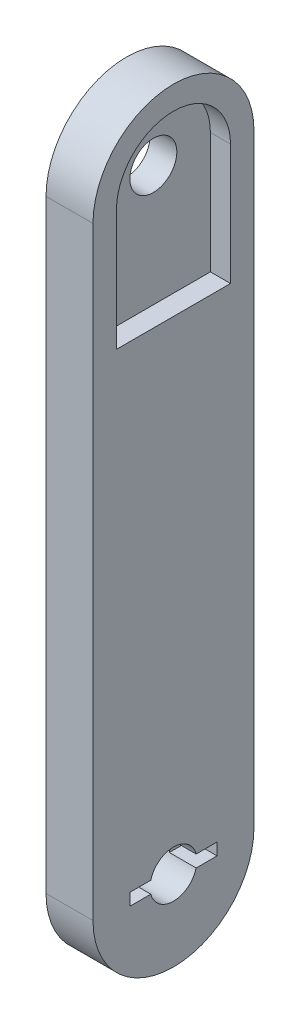
ISO-10303-21;
HEADER;
FILE_DESCRIPTION(('STEP AP214'),'2;1');
FILE_NAME('part.step','',(''),(''),'','','');
FILE_SCHEMA(('AUTOMOTIVE_DESIGN { 1 0 10303 214 1 1 1 1 }'));
ENDSEC;
DATA;
#1=APPLICATION_CONTEXT('core data for automotive mechanical design processes');
#2=APPLICATION_PROTOCOL_DEFINITION('international standard','automotive_design',2000,#1);
#3=PRODUCT_CONTEXT('',#1,'mechanical');
#4=PRODUCT('Part','Part','',(#3));
#5=PRODUCT_RELATED_PRODUCT_CATEGORY('part','',(#4));
#6=PRODUCT_DEFINITION_FORMATION('','',#4);
#7=PRODUCT_DEFINITION_CONTEXT('part definition',#1,'design');
#8=PRODUCT_DEFINITION('design','',#6,#7);
#9=PRODUCT_DEFINITION_SHAPE('','',#8);
#10=(LENGTH_UNIT() NAMED_UNIT(*) SI_UNIT(.MILLI.,.METRE.));
#11=(NAMED_UNIT(*) PLANE_ANGLE_UNIT() SI_UNIT($,.RADIAN.));
#12=(NAMED_UNIT(*) SI_UNIT($,.STERADIAN.) SOLID_ANGLE_UNIT());
#13=UNCERTAINTY_MEASURE_WITH_UNIT(LENGTH_MEASURE(1.E-05),#10,'distance_accuracy_value','');
#14=(GEOMETRIC_REPRESENTATION_CONTEXT(3) GLOBAL_UNCERTAINTY_ASSIGNED_CONTEXT((#13)) GLOBAL_UNIT_ASSIGNED_CONTEXT((#10,
#11,#12)) REPRESENTATION_CONTEXT('',''));
#15=CARTESIAN_POINT('',(0.,0.,0.));
#16=DIRECTION('',(0.,0.,1.));
#17=DIRECTION('',(1.,0.,0.));
#18=AXIS2_PLACEMENT_3D('',#15,#16,#17);
#19=CARTESIAN_POINT('',(7.,45.,0.));
#20=DIRECTION('',(-1.,0.,0.));
#21=DIRECTION('',(0.,0.,1.));
#22=AXIS2_PLACEMENT_3D('',#19,#20,#21);
#23=CYLINDRICAL_SURFACE('',#22,3.5);
#24=CARTESIAN_POINT('',(0.,45.,0.));
#25=DIRECTION('',(1.,0.,0.));
#26=DIRECTION('',(0.,0.,-1.));
#27=AXIS2_PLACEMENT_3D('',#24,#25,#26);
#28=CIRCLE('',#27,3.5);
#29=CARTESIAN_POINT('',(0.,45.,-3.5));
#30=VERTEX_POINT('',#29);
#31=EDGE_CURVE('E227',#30,#30,#28,.T.);
#32=ORIENTED_EDGE('',*,*,#31,.F.);
#33=EDGE_LOOP('',(#32));
#34=FACE_BOUND('',#33,.T.);
#35=CARTESIAN_POINT('',(4.,45.,0.));
#36=DIRECTION('',(1.,0.,0.));
#37=DIRECTION('',(0.,0.,-1.));
#38=AXIS2_PLACEMENT_3D('',#35,#36,#37);
#39=CIRCLE('',#38,3.5);
#40=CARTESIAN_POINT('',(4.,45.,-3.5));
#41=VERTEX_POINT('',#40);
#42=EDGE_CURVE('E217',#41,#41,#39,.T.);
#43=ORIENTED_EDGE('',*,*,#42,.T.);
#44=EDGE_LOOP('',(#43));
#45=FACE_BOUND('',#44,.T.);
#46=ADVANCED_FACE('F37',(#34,#45),#23,.F.);
#47=CARTESIAN_POINT('',(7.,45.,0.));
#48=DIRECTION('',(1.,0.,0.));
#49=DIRECTION('',(0.,0.,-1.));
#50=AXIS2_PLACEMENT_3D('',#47,#48,#49);
#51=PLANE('',#50);
#52=DIRECTION('',(0.,0.,1.));
#53=VECTOR('',#52,1.);
#54=CARTESIAN_POINT('',(7.,-44.1,6.5));
#55=LINE('',#54,#53);
#56=CARTESIAN_POINT('',(7.,-44.1,3.38230690505755));
#57=VERTEX_POINT('',#56);
#58=CARTESIAN_POINT('',(7.,-44.1,6.5));
#59=VERTEX_POINT('',#58);
#60=EDGE_CURVE('E173',#57,#59,#55,.T.);
#61=ORIENTED_EDGE('',*,*,#60,.F.);
#62=CARTESIAN_POINT('',(7.,-45.,0.));
#63=DIRECTION('',(1.,0.,0.));
#64=DIRECTION('',(0.,0.,-1.));
#65=AXIS2_PLACEMENT_3D('',#62,#63,#64);
#66=CIRCLE('',#65,3.5);
#67=CARTESIAN_POINT('',(7.,-44.1,-3.38230690505755));
#68=VERTEX_POINT('',#67);
#69=EDGE_CURVE('E224',#68,#57,#66,.T.);
#70=ORIENTED_EDGE('',*,*,#69,.F.);
#71=CARTESIAN_POINT('',(7.,-44.1,-6.5));
#72=VERTEX_POINT('',#71);
#73=EDGE_CURVE('E171',#72,#68,#55,.T.);
#74=ORIENTED_EDGE('',*,*,#73,.F.);
#75=DIRECTION('',(0.,1.,0.));
#76=VECTOR('',#75,1.);
#77=CARTESIAN_POINT('',(7.,-44.1,-6.5));
#78=LINE('',#77,#76);
#79=CARTESIAN_POINT('',(7.,-45.9,-6.5));
#80=VERTEX_POINT('',#79);
#81=EDGE_CURVE('E182',#80,#72,#78,.T.);
#82=ORIENTED_EDGE('',*,*,#81,.F.);
#83=DIRECTION('',(0.,0.,-1.));
#84=VECTOR('',#83,1.);
#85=CARTESIAN_POINT('',(7.,-45.9,6.5));
#86=LINE('',#85,#84);
#87=CARTESIAN_POINT('',(7.,-45.9,-3.38230690505755));
#88=VERTEX_POINT('',#87);
#89=EDGE_CURVE('E179',#88,#80,#86,.T.);
#90=ORIENTED_EDGE('',*,*,#89,.F.);
#91=CARTESIAN_POINT('',(7.,-45.9,3.38230690505755));
#92=VERTEX_POINT('',#91);
#93=EDGE_CURVE('E228',#92,#88,#66,.T.);
#94=ORIENTED_EDGE('',*,*,#93,.F.);
#95=CARTESIAN_POINT('',(7.,-45.9,6.5));
#96=VERTEX_POINT('',#95);
#97=EDGE_CURVE('E180',#96,#92,#86,.T.);
#98=ORIENTED_EDGE('',*,*,#97,.F.);
#99=DIRECTION('',(0.,-1.,0.));
#100=VECTOR('',#99,1.);
#101=CARTESIAN_POINT('',(7.,-44.1,6.5));
#102=LINE('',#101,#100);
#103=EDGE_CURVE('E156',#59,#96,#102,.T.);
#104=ORIENTED_EDGE('',*,*,#103,.F.);
#105=EDGE_LOOP('',(#61,#70,#74,#82,#90,#94,#98,#104));
#106=FACE_BOUND('',#105,.T.);
#107=CARTESIAN_POINT('',(7.,45.,0.));
#108=DIRECTION('',(1.,0.,0.));
#109=DIRECTION('',(0.,0.,-1.));
#110=AXIS2_PLACEMENT_3D('',#107,#108,#109);
#111=CIRCLE('',#110,8.5);
#112=CARTESIAN_POINT('',(7.,45.,-8.5));
#113=VERTEX_POINT('',#112);
#114=CARTESIAN_POINT('',(7.,45.,8.5));
#115=VERTEX_POINT('',#114);
#116=EDGE_CURVE('E187',#113,#115,#111,.T.);
#117=ORIENTED_EDGE('',*,*,#116,.F.);
#118=DIRECTION('',(0.,1.,0.));
#119=VECTOR('',#118,1.);
#120=CARTESIAN_POINT('',(7.,27.,-8.50000000000001));
#121=LINE('',#120,#119);
#122=CARTESIAN_POINT('',(7.,27.,-8.50000000000001));
#123=VERTEX_POINT('',#122);
#124=EDGE_CURVE('E196',#123,#113,#121,.T.);
#125=ORIENTED_EDGE('',*,*,#124,.F.);
#126=DIRECTION('',(0.,0.,-1.));
#127=VECTOR('',#126,1.);
#128=CARTESIAN_POINT('',(7.,27.,8.5));
#129=LINE('',#128,#127);
#130=CARTESIAN_POINT('',(7.,27.,8.5));
#131=VERTEX_POINT('',#130);
#132=EDGE_CURVE('E210',#131,#123,#129,.T.);
#133=ORIENTED_EDGE('',*,*,#132,.F.);
#134=DIRECTION('',(0.,-1.,0.));
#135=VECTOR('',#134,1.);
#136=CARTESIAN_POINT('',(7.,45.,8.5));
#137=LINE('',#136,#135);
#138=EDGE_CURVE('E207',#115,#131,#137,.T.);
#139=ORIENTED_EDGE('',*,*,#138,.F.);
#140=EDGE_LOOP('',(#117,#125,#133,#139));
#141=FACE_BOUND('',#140,.T.);
#142=CARTESIAN_POINT('',(7.,45.,0.));
#143=DIRECTION('',(1.,0.,0.));
#144=DIRECTION('',(0.,0.,-1.));
#145=AXIS2_PLACEMENT_3D('',#142,#143,#144);
#146=CIRCLE('',#145,12.);
#147=CARTESIAN_POINT('',(7.,45.,-12.));
#148=VERTEX_POINT('',#147);
#149=CARTESIAN_POINT('',(7.,45.,12.));
#150=VERTEX_POINT('',#149);
#151=EDGE_CURVE('E235',#148,#150,#146,.T.);
#152=ORIENTED_EDGE('',*,*,#151,.T.);
#153=DIRECTION('',(0.,-1.,0.));
#154=VECTOR('',#153,1.);
#155=CARTESIAN_POINT('',(7.,45.,12.));
#156=LINE('',#155,#154);
#157=CARTESIAN_POINT('',(7.,-45.,12.));
#158=VERTEX_POINT('',#157);
#159=EDGE_CURVE('E238',#150,#158,#156,.T.);
#160=ORIENTED_EDGE('',*,*,#159,.T.);
#161=CARTESIAN_POINT('',(7.,-45.,0.));
#162=DIRECTION('',(1.,0.,0.));
#163=DIRECTION('',(0.,0.,-1.));
#164=AXIS2_PLACEMENT_3D('',#161,#162,#163);
#165=CIRCLE('',#164,12.);
#166=CARTESIAN_POINT('',(7.,-45.,-12.));
#167=VERTEX_POINT('',#166);
#168=EDGE_CURVE('E241',#158,#167,#165,.T.);
#169=ORIENTED_EDGE('',*,*,#168,.T.);
#170=DIRECTION('',(0.,1.,0.));
#171=VECTOR('',#170,1.);
#172=CARTESIAN_POINT('',(7.,45.,-12.));
#173=LINE('',#172,#171);
#174=EDGE_CURVE('E243',#167,#148,#173,.T.);
#175=ORIENTED_EDGE('',*,*,#174,.T.);
#176=EDGE_LOOP('',(#152,#160,#169,#175));
#177=FACE_BOUND('',#176,.T.);
#178=ADVANCED_FACE('F283',(#106,#141,#177),#51,.T.);
#179=CARTESIAN_POINT('',(0.,45.,0.));
#180=DIRECTION('',(1.,0.,0.));
#181=DIRECTION('',(0.,0.,-1.));
#182=AXIS2_PLACEMENT_3D('',#179,#180,#181);
#183=PLANE('',#182);
#184=CARTESIAN_POINT('',(0.,45.,0.));
#185=DIRECTION('',(1.,0.,0.));
#186=DIRECTION('',(0.,0.,-1.));
#187=AXIS2_PLACEMENT_3D('',#184,#185,#186);
#188=CIRCLE('',#187,12.);
#189=CARTESIAN_POINT('',(0.,45.,-12.));
#190=VERTEX_POINT('',#189);
#191=CARTESIAN_POINT('',(0.,45.,12.));
#192=VERTEX_POINT('',#191);
#193=EDGE_CURVE('E234',#190,#192,#188,.T.);
#194=ORIENTED_EDGE('',*,*,#193,.F.);
#195=DIRECTION('',(0.,1.,0.));
#196=VECTOR('',#195,1.);
#197=CARTESIAN_POINT('',(0.,45.,-12.));
#198=LINE('',#197,#196);
#199=CARTESIAN_POINT('',(0.,-45.,-12.));
#200=VERTEX_POINT('',#199);
#201=EDGE_CURVE('E239',#200,#190,#198,.T.);
#202=ORIENTED_EDGE('',*,*,#201,.F.);
#203=CARTESIAN_POINT('',(0.,-45.,0.));
#204=DIRECTION('',(1.,0.,0.));
#205=DIRECTION('',(0.,0.,-1.));
#206=AXIS2_PLACEMENT_3D('',#203,#204,#205);
#207=CIRCLE('',#206,12.);
#208=CARTESIAN_POINT('',(0.,-45.,12.));
#209=VERTEX_POINT('',#208);
#210=EDGE_CURVE('E250',#209,#200,#207,.T.);
#211=ORIENTED_EDGE('',*,*,#210,.F.);
#212=DIRECTION('',(0.,-1.,0.));
#213=VECTOR('',#212,1.);
#214=CARTESIAN_POINT('',(0.,45.,12.));
#215=LINE('',#214,#213);
#216=EDGE_CURVE('E248',#192,#209,#215,.T.);
#217=ORIENTED_EDGE('',*,*,#216,.F.);
#218=EDGE_LOOP('',(#194,#202,#211,#217));
#219=FACE_BOUND('',#218,.T.);
#220=ORIENTED_EDGE('',*,*,#31,.T.);
#221=EDGE_LOOP('',(#220));
#222=FACE_BOUND('',#221,.T.);
#223=CARTESIAN_POINT('',(0.,-45.,0.));
#224=DIRECTION('',(1.,0.,0.));
#225=DIRECTION('',(0.,0.,-1.));
#226=AXIS2_PLACEMENT_3D('',#223,#224,#225);
#227=CIRCLE('',#226,3.5);
#228=CARTESIAN_POINT('',(0.,-45.,-3.5));
#229=VERTEX_POINT('',#228);
#230=EDGE_CURVE('E229',#229,#229,#227,.T.);
#231=ORIENTED_EDGE('',*,*,#230,.T.);
#232=EDGE_LOOP('',(#231));
#233=FACE_BOUND('',#232,.T.);
#234=ADVANCED_FACE('F315',(#219,#222,#233),#183,.F.);
#235=CARTESIAN_POINT('',(7.,45.,0.));
#236=DIRECTION('',(-1.,0.,0.));
#237=DIRECTION('',(0.,0.,1.));
#238=AXIS2_PLACEMENT_3D('',#235,#236,#237);
#239=CYLINDRICAL_SURFACE('',#238,12.);
#240=ORIENTED_EDGE('',*,*,#193,.T.);
#241=DIRECTION('',(-1.,0.,0.));
#242=VECTOR('',#241,1.);
#243=CARTESIAN_POINT('',(7.,45.,12.));
#244=LINE('',#243,#242);
#245=EDGE_CURVE('E261',#150,#192,#244,.T.);
#246=ORIENTED_EDGE('',*,*,#245,.F.);
#247=ORIENTED_EDGE('',*,*,#151,.F.);
#248=DIRECTION('',(-1.,0.,0.));
#249=VECTOR('',#248,1.);
#250=CARTESIAN_POINT('',(7.,45.,-12.));
#251=LINE('',#250,#249);
#252=EDGE_CURVE('E245',#148,#190,#251,.T.);
#253=ORIENTED_EDGE('',*,*,#252,.T.);
#254=EDGE_LOOP('',(#240,#246,#247,#253));
#255=FACE_BOUND('',#254,.T.);
#256=ADVANCED_FACE('F39',(#255),#239,.T.);
#257=CARTESIAN_POINT('',(7.,45.,12.));
#258=DIRECTION('',(0.,0.,-1.));
#259=DIRECTION('',(-1.,0.,0.));
#260=AXIS2_PLACEMENT_3D('',#257,#258,#259);
#261=PLANE('',#260);
#262=ORIENTED_EDGE('',*,*,#216,.T.);
#263=DIRECTION('',(-1.,0.,0.));
#264=VECTOR('',#263,1.);
#265=CARTESIAN_POINT('',(7.,-45.,12.));
#266=LINE('',#265,#264);
#267=EDGE_CURVE('E258',#158,#209,#266,.T.);
#268=ORIENTED_EDGE('',*,*,#267,.F.);
#269=ORIENTED_EDGE('',*,*,#159,.F.);
#270=ORIENTED_EDGE('',*,*,#245,.T.);
#271=EDGE_LOOP('',(#262,#268,#269,#270));
#272=FACE_BOUND('',#271,.T.);
#273=ADVANCED_FACE('F331',(#272),#261,.F.);
#274=CARTESIAN_POINT('',(7.,-45.,0.));
#275=DIRECTION('',(-1.,0.,0.));
#276=DIRECTION('',(0.,0.,1.));
#277=AXIS2_PLACEMENT_3D('',#274,#275,#276);
#278=CYLINDRICAL_SURFACE('',#277,12.);
#279=ORIENTED_EDGE('',*,*,#210,.T.);
#280=DIRECTION('',(-1.,0.,0.));
#281=VECTOR('',#280,1.);
#282=CARTESIAN_POINT('',(7.,-45.,-12.));
#283=LINE('',#282,#281);
#284=EDGE_CURVE('E255',#167,#200,#283,.T.);
#285=ORIENTED_EDGE('',*,*,#284,.F.);
#286=ORIENTED_EDGE('',*,*,#168,.F.);
#287=ORIENTED_EDGE('',*,*,#267,.T.);
#288=EDGE_LOOP('',(#279,#285,#286,#287));
#289=FACE_BOUND('',#288,.T.);
#290=ADVANCED_FACE('F328',(#289),#278,.T.);
#291=CARTESIAN_POINT('',(7.,45.,-12.));
#292=DIRECTION('',(0.,0.,1.));
#293=DIRECTION('',(1.,0.,0.));
#294=AXIS2_PLACEMENT_3D('',#291,#292,#293);
#295=PLANE('',#294);
#296=ORIENTED_EDGE('',*,*,#201,.T.);
#297=ORIENTED_EDGE('',*,*,#252,.F.);
#298=ORIENTED_EDGE('',*,*,#174,.F.);
#299=ORIENTED_EDGE('',*,*,#284,.T.);
#300=EDGE_LOOP('',(#296,#297,#298,#299));
#301=FACE_BOUND('',#300,.T.);
#302=ADVANCED_FACE('F325',(#301),#295,.F.);
#303=CARTESIAN_POINT('',(7.,-45.,0.));
#304=DIRECTION('',(-1.,0.,0.));
#305=DIRECTION('',(0.,0.,1.));
#306=AXIS2_PLACEMENT_3D('',#303,#304,#305);
#307=CYLINDRICAL_SURFACE('',#306,3.5);
#308=DIRECTION('',(-1.,0.,0.));
#309=VECTOR('',#308,1.);
#310=CARTESIAN_POINT('',(7.,-44.1,3.38230690505755));
#311=LINE('',#310,#309);
#312=CARTESIAN_POINT('',(3.,-44.1,3.38230690505755));
#313=VERTEX_POINT('',#312);
#314=EDGE_CURVE('E11',#313,#57,#311,.F.);
#315=ORIENTED_EDGE('',*,*,#314,.F.);
#316=CARTESIAN_POINT('',(3.,-45.,0.));
#317=DIRECTION('',(1.,0.,0.));
#318=DIRECTION('',(0.,0.,-1.));
#319=AXIS2_PLACEMENT_3D('',#316,#317,#318);
#320=CIRCLE('',#319,3.5);
#321=CARTESIAN_POINT('',(3.,-45.9,3.38230690505755));
#322=VERTEX_POINT('',#321);
#323=EDGE_CURVE('E270',#313,#322,#320,.T.);
#324=ORIENTED_EDGE('',*,*,#323,.T.);
#325=DIRECTION('',(-1.,0.,0.));
#326=VECTOR('',#325,1.);
#327=CARTESIAN_POINT('',(7.,-45.9,3.38230690505755));
#328=LINE('',#327,#326);
#329=EDGE_CURVE('E45',#92,#322,#328,.T.);
#330=ORIENTED_EDGE('',*,*,#329,.F.);
#331=ORIENTED_EDGE('',*,*,#93,.T.);
#332=DIRECTION('',(-1.,0.,0.));
#333=VECTOR('',#332,1.);
#334=CARTESIAN_POINT('',(7.,-45.9,-3.38230690505755));
#335=LINE('',#334,#333);
#336=CARTESIAN_POINT('',(3.,-45.9,-3.38230690505755));
#337=VERTEX_POINT('',#336);
#338=EDGE_CURVE('E269',#337,#88,#335,.F.);
#339=ORIENTED_EDGE('',*,*,#338,.F.);
#340=CARTESIAN_POINT('',(3.,-44.1,-3.38230690505755));
#341=VERTEX_POINT('',#340);
#342=EDGE_CURVE('E264',#337,#341,#320,.T.);
#343=ORIENTED_EDGE('',*,*,#342,.T.);
#344=DIRECTION('',(-1.,0.,0.));
#345=VECTOR('',#344,1.);
#346=CARTESIAN_POINT('',(7.,-44.1,-3.38230690505755));
#347=LINE('',#346,#345);
#348=EDGE_CURVE('E272',#68,#341,#347,.T.);
#349=ORIENTED_EDGE('',*,*,#348,.F.);
#350=ORIENTED_EDGE('',*,*,#69,.T.);
#351=EDGE_LOOP('',(#315,#324,#330,#331,#339,#343,#349,#350));
#352=FACE_BOUND('',#351,.T.);
#353=ORIENTED_EDGE('',*,*,#230,.F.);
#354=EDGE_LOOP('',(#353));
#355=FACE_BOUND('',#354,.T.);
#356=ADVANCED_FACE('F275',(#352,#355),#307,.F.);
#357=CARTESIAN_POINT('',(4.,45.,0.));
#358=DIRECTION('',(1.,0.,0.));
#359=DIRECTION('',(0.,0.,-1.));
#360=AXIS2_PLACEMENT_3D('',#357,#358,#359);
#361=CYLINDRICAL_SURFACE('',#360,8.5);
#362=ORIENTED_EDGE('',*,*,#116,.T.);
#363=DIRECTION('',(1.,0.,0.));
#364=VECTOR('',#363,1.);
#365=CARTESIAN_POINT('',(4.,45.,8.5));
#366=LINE('',#365,#364);
#367=CARTESIAN_POINT('',(4.,45.,8.5));
#368=VERTEX_POINT('',#367);
#369=EDGE_CURVE('E205',#368,#115,#366,.T.);
#370=ORIENTED_EDGE('',*,*,#369,.F.);
#371=CARTESIAN_POINT('',(4.,45.,0.));
#372=DIRECTION('',(1.,0.,0.));
#373=DIRECTION('',(0.,0.,-1.));
#374=AXIS2_PLACEMENT_3D('',#371,#372,#373);
#375=CIRCLE('',#374,8.5);
#376=CARTESIAN_POINT('',(4.,45.,-8.5));
#377=VERTEX_POINT('',#376);
#378=EDGE_CURVE('E192',#377,#368,#375,.T.);
#379=ORIENTED_EDGE('',*,*,#378,.F.);
#380=DIRECTION('',(1.,0.,0.));
#381=VECTOR('',#380,1.);
#382=CARTESIAN_POINT('',(4.,45.,-8.5));
#383=LINE('',#382,#381);
#384=EDGE_CURVE('E215',#377,#113,#383,.T.);
#385=ORIENTED_EDGE('',*,*,#384,.T.);
#386=EDGE_LOOP('',(#362,#370,#379,#385));
#387=FACE_BOUND('',#386,.T.);
#388=ADVANCED_FACE('F354',(#387),#361,.F.);
#389=CARTESIAN_POINT('',(4.,27.,-8.50000000000001));
#390=DIRECTION('',(0.,0.,-1.));
#391=DIRECTION('',(0.,1.,0.));
#392=AXIS2_PLACEMENT_3D('',#389,#390,#391);
#393=PLANE('',#392);
#394=ORIENTED_EDGE('',*,*,#124,.T.);
#395=ORIENTED_EDGE('',*,*,#384,.F.);
#396=DIRECTION('',(0.,1.,0.));
#397=VECTOR('',#396,1.);
#398=CARTESIAN_POINT('',(4.,27.,-8.50000000000001));
#399=LINE('',#398,#397);
#400=CARTESIAN_POINT('',(4.,27.,-8.50000000000001));
#401=VERTEX_POINT('',#400);
#402=EDGE_CURVE('E202',#401,#377,#399,.T.);
#403=ORIENTED_EDGE('',*,*,#402,.F.);
#404=DIRECTION('',(1.,0.,0.));
#405=VECTOR('',#404,1.);
#406=CARTESIAN_POINT('',(4.,27.,-8.50000000000001));
#407=LINE('',#406,#405);
#408=EDGE_CURVE('E218',#401,#123,#407,.T.);
#409=ORIENTED_EDGE('',*,*,#408,.T.);
#410=EDGE_LOOP('',(#394,#395,#403,#409));
#411=FACE_BOUND('',#410,.T.);
#412=ADVANCED_FACE('F358',(#411),#393,.F.);
#413=CARTESIAN_POINT('',(4.,27.,8.5));
#414=DIRECTION('',(0.,-1.,0.));
#415=DIRECTION('',(0.,0.,-1.));
#416=AXIS2_PLACEMENT_3D('',#413,#414,#415);
#417=PLANE('',#416);
#418=ORIENTED_EDGE('',*,*,#132,.T.);
#419=ORIENTED_EDGE('',*,*,#408,.F.);
#420=DIRECTION('',(0.,0.,-1.));
#421=VECTOR('',#420,1.);
#422=CARTESIAN_POINT('',(4.,27.,8.5));
#423=LINE('',#422,#421);
#424=CARTESIAN_POINT('',(4.,27.,8.5));
#425=VERTEX_POINT('',#424);
#426=EDGE_CURVE('E199',#425,#401,#423,.T.);
#427=ORIENTED_EDGE('',*,*,#426,.F.);
#428=DIRECTION('',(1.,0.,0.));
#429=VECTOR('',#428,1.);
#430=CARTESIAN_POINT('',(4.,27.,8.5));
#431=LINE('',#430,#429);
#432=EDGE_CURVE('E220',#425,#131,#431,.T.);
#433=ORIENTED_EDGE('',*,*,#432,.T.);
#434=EDGE_LOOP('',(#418,#419,#427,#433));
#435=FACE_BOUND('',#434,.T.);
#436=ADVANCED_FACE('F363',(#435),#417,.F.);
#437=CARTESIAN_POINT('',(4.,45.,8.5));
#438=DIRECTION('',(0.,0.,1.));
#439=DIRECTION('',(1.,0.,0.));
#440=AXIS2_PLACEMENT_3D('',#437,#438,#439);
#441=PLANE('',#440);
#442=ORIENTED_EDGE('',*,*,#138,.T.);
#443=ORIENTED_EDGE('',*,*,#432,.F.);
#444=DIRECTION('',(0.,-1.,0.));
#445=VECTOR('',#444,1.);
#446=CARTESIAN_POINT('',(4.,45.,8.5));
#447=LINE('',#446,#445);
#448=EDGE_CURVE('E195',#368,#425,#447,.T.);
#449=ORIENTED_EDGE('',*,*,#448,.F.);
#450=ORIENTED_EDGE('',*,*,#369,.T.);
#451=EDGE_LOOP('',(#442,#443,#449,#450));
#452=FACE_BOUND('',#451,.T.);
#453=ADVANCED_FACE('F367',(#452),#441,.F.);
#454=CARTESIAN_POINT('',(4.,45.,0.));
#455=DIRECTION('',(1.,0.,0.));
#456=DIRECTION('',(0.,0.,-1.));
#457=AXIS2_PLACEMENT_3D('',#454,#455,#456);
#458=PLANE('',#457);
#459=ORIENTED_EDGE('',*,*,#42,.F.);
#460=EDGE_LOOP('',(#459));
#461=FACE_BOUND('',#460,.T.);
#462=ORIENTED_EDGE('',*,*,#378,.T.);
#463=ORIENTED_EDGE('',*,*,#448,.T.);
#464=ORIENTED_EDGE('',*,*,#426,.T.);
#465=ORIENTED_EDGE('',*,*,#402,.T.);
#466=EDGE_LOOP('',(#462,#463,#464,#465));
#467=FACE_BOUND('',#466,.T.);
#468=ADVANCED_FACE('F370',(#461,#467),#458,.T.);
#469=CARTESIAN_POINT('',(3.,0.,0.));
#470=DIRECTION('',(1.,0.,0.));
#471=DIRECTION('',(0.,0.,-1.));
#472=AXIS2_PLACEMENT_3D('',#469,#470,#471);
#473=PLANE('',#472);
#474=DIRECTION('',(0.,0.,-1.));
#475=VECTOR('',#474,1.);
#476=CARTESIAN_POINT('',(3.,-45.9,6.5));
#477=LINE('',#476,#475);
#478=CARTESIAN_POINT('',(3.,-45.9,-6.5));
#479=VERTEX_POINT('',#478);
#480=EDGE_CURVE('E165',#337,#479,#477,.T.);
#481=ORIENTED_EDGE('',*,*,#480,.T.);
#482=DIRECTION('',(0.,1.,0.));
#483=VECTOR('',#482,1.);
#484=CARTESIAN_POINT('',(3.,-44.1,-6.5));
#485=LINE('',#484,#483);
#486=CARTESIAN_POINT('',(3.,-44.1,-6.5));
#487=VERTEX_POINT('',#486);
#488=EDGE_CURVE('E164',#479,#487,#485,.T.);
#489=ORIENTED_EDGE('',*,*,#488,.T.);
#490=DIRECTION('',(0.,0.,1.));
#491=VECTOR('',#490,1.);
#492=CARTESIAN_POINT('',(3.,-44.1,6.5));
#493=LINE('',#492,#491);
#494=EDGE_CURVE('E60',#487,#341,#493,.T.);
#495=ORIENTED_EDGE('',*,*,#494,.T.);
#496=ORIENTED_EDGE('',*,*,#342,.F.);
#497=EDGE_LOOP('',(#481,#489,#495,#496));
#498=FACE_BOUND('',#497,.T.);
#499=ADVANCED_FACE('F295',(#498),#473,.T.);
#500=CARTESIAN_POINT('',(3.,-45.9,6.5));
#501=DIRECTION('',(0.,-1.,0.));
#502=DIRECTION('',(0.,0.,-1.));
#503=AXIS2_PLACEMENT_3D('',#500,#501,#502);
#504=PLANE('',#503);
#505=ORIENTED_EDGE('',*,*,#338,.T.);
#506=ORIENTED_EDGE('',*,*,#89,.T.);
#507=DIRECTION('',(1.,0.,0.));
#508=VECTOR('',#507,1.);
#509=CARTESIAN_POINT('',(3.,-45.9,-6.5));
#510=LINE('',#509,#508);
#511=EDGE_CURVE('E159',#479,#80,#510,.T.);
#512=ORIENTED_EDGE('',*,*,#511,.F.);
#513=ORIENTED_EDGE('',*,*,#480,.F.);
#514=EDGE_LOOP('',(#505,#506,#512,#513));
#515=FACE_BOUND('',#514,.T.);
#516=ADVANCED_FACE('F292',(#515),#504,.F.);
#517=CARTESIAN_POINT('',(3.,-44.1,6.5));
#518=DIRECTION('',(0.,1.,0.));
#519=DIRECTION('',(0.,0.,1.));
#520=AXIS2_PLACEMENT_3D('',#517,#518,#519);
#521=PLANE('',#520);
#522=ORIENTED_EDGE('',*,*,#348,.T.);
#523=ORIENTED_EDGE('',*,*,#494,.F.);
#524=DIRECTION('',(1.,0.,0.));
#525=VECTOR('',#524,1.);
#526=CARTESIAN_POINT('',(3.,-44.1,-6.5));
#527=LINE('',#526,#525);
#528=EDGE_CURVE('E188',#487,#72,#527,.T.);
#529=ORIENTED_EDGE('',*,*,#528,.T.);
#530=ORIENTED_EDGE('',*,*,#73,.T.);
#531=EDGE_LOOP('',(#522,#523,#529,#530));
#532=FACE_BOUND('',#531,.T.);
#533=ADVANCED_FACE('F298',(#532),#521,.F.);
#534=CARTESIAN_POINT('',(3.,-44.1,-6.5));
#535=DIRECTION('',(0.,0.,-1.));
#536=DIRECTION('',(-1.,0.,0.));
#537=AXIS2_PLACEMENT_3D('',#534,#535,#536);
#538=PLANE('',#537);
#539=ORIENTED_EDGE('',*,*,#81,.T.);
#540=ORIENTED_EDGE('',*,*,#528,.F.);
#541=ORIENTED_EDGE('',*,*,#488,.F.);
#542=ORIENTED_EDGE('',*,*,#511,.T.);
#543=EDGE_LOOP('',(#539,#540,#541,#542));
#544=FACE_BOUND('',#543,.T.);
#545=ADVANCED_FACE('F300',(#544),#538,.F.);
#546=ORIENTED_EDGE('',*,*,#329,.T.);
#547=CARTESIAN_POINT('',(3.,-45.9,6.5));
#548=VERTEX_POINT('',#547);
#549=EDGE_CURVE('E52',#548,#322,#477,.T.);
#550=ORIENTED_EDGE('',*,*,#549,.F.);
#551=DIRECTION('',(1.,0.,0.));
#552=VECTOR('',#551,1.);
#553=CARTESIAN_POINT('',(3.,-45.9,6.5));
#554=LINE('',#553,#552);
#555=EDGE_CURVE('E151',#548,#96,#554,.T.);
#556=ORIENTED_EDGE('',*,*,#555,.T.);
#557=ORIENTED_EDGE('',*,*,#97,.T.);
#558=EDGE_LOOP('',(#546,#550,#556,#557));
#559=FACE_BOUND('',#558,.T.);
#560=ADVANCED_FACE('F161',(#559),#504,.F.);
#561=CARTESIAN_POINT('',(3.,-44.1,6.5));
#562=VERTEX_POINT('',#561);
#563=EDGE_CURVE('E169',#313,#562,#493,.T.);
#564=ORIENTED_EDGE('',*,*,#563,.T.);
#565=DIRECTION('',(0.,-1.,0.));
#566=VECTOR('',#565,1.);
#567=CARTESIAN_POINT('',(3.,-44.1,6.5));
#568=LINE('',#567,#566);
#569=EDGE_CURVE('E154',#562,#548,#568,.T.);
#570=ORIENTED_EDGE('',*,*,#569,.T.);
#571=ORIENTED_EDGE('',*,*,#549,.T.);
#572=ORIENTED_EDGE('',*,*,#323,.F.);
#573=EDGE_LOOP('',(#564,#570,#571,#572));
#574=FACE_BOUND('',#573,.T.);
#575=ADVANCED_FACE('F167',(#574),#473,.T.);
#576=CARTESIAN_POINT('',(3.,-44.1,6.5));
#577=DIRECTION('',(0.,0.,1.));
#578=DIRECTION('',(1.,0.,0.));
#579=AXIS2_PLACEMENT_3D('',#576,#577,#578);
#580=PLANE('',#579);
#581=ORIENTED_EDGE('',*,*,#103,.T.);
#582=ORIENTED_EDGE('',*,*,#555,.F.);
#583=ORIENTED_EDGE('',*,*,#569,.F.);
#584=DIRECTION('',(1.,0.,0.));
#585=VECTOR('',#584,1.);
#586=CARTESIAN_POINT('',(3.,-44.1,6.5));
#587=LINE('',#586,#585);
#588=EDGE_CURVE('E185',#562,#59,#587,.T.);
#589=ORIENTED_EDGE('',*,*,#588,.T.);
#590=EDGE_LOOP('',(#581,#582,#583,#589));
#591=FACE_BOUND('',#590,.T.);
#592=ADVANCED_FACE('F152',(#591),#580,.F.);
#593=ORIENTED_EDGE('',*,*,#314,.T.);
#594=ORIENTED_EDGE('',*,*,#60,.T.);
#595=ORIENTED_EDGE('',*,*,#588,.F.);
#596=ORIENTED_EDGE('',*,*,#563,.F.);
#597=EDGE_LOOP('',(#593,#594,#595,#596));
#598=FACE_BOUND('',#597,.T.);
#599=ADVANCED_FACE('F280',(#598),#521,.F.);
#600=CLOSED_SHELL('',(#46,#178,#234,#256,#273,#290,#302,#356,#388,#412,#436,#453,#468,#499,#516,
#533,#545,#560,#575,#592,#599));
#601=MANIFOLD_SOLID_BREP('B2',#600);
#602=ADVANCED_BREP_SHAPE_REPRESENTATION('',(#18,#601),#14);
#603=SHAPE_DEFINITION_REPRESENTATION(#9,#602);
ENDSEC;
END-ISO-10303-21;
